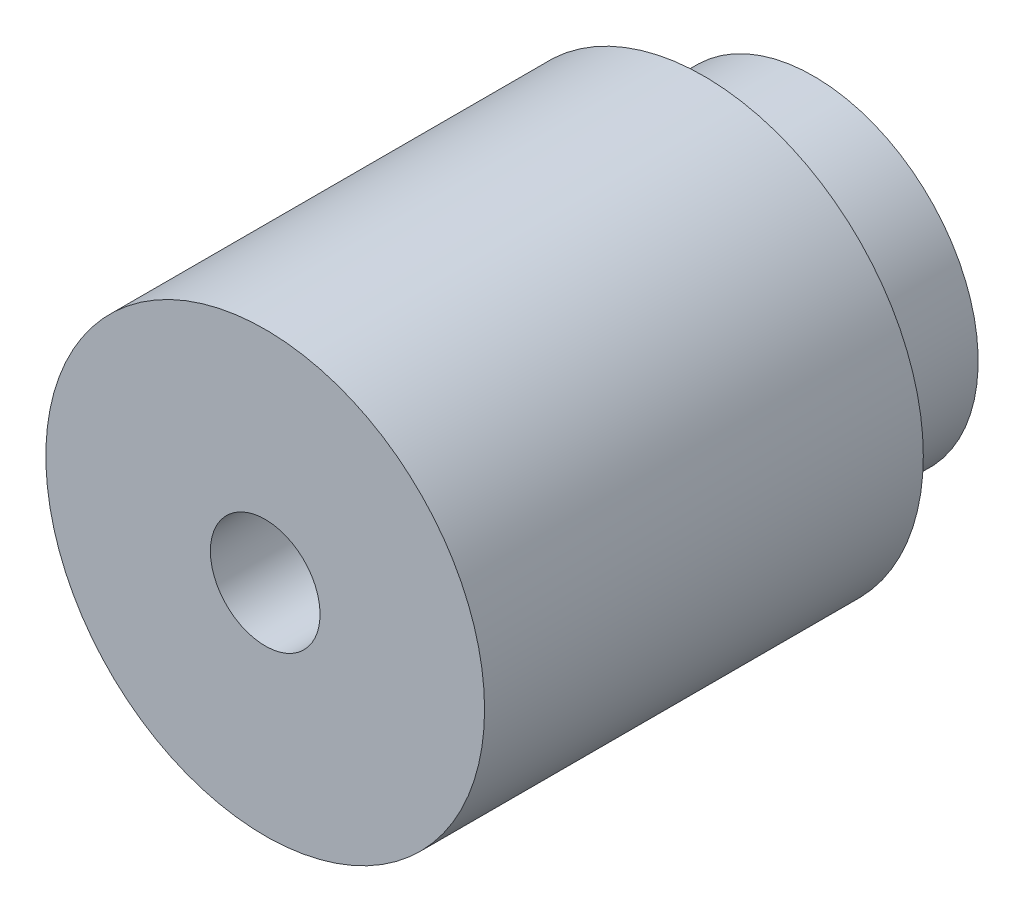
ISO-10303-21;
HEADER;
FILE_DESCRIPTION(('STEP AP214'),'2;1');
FILE_NAME('part.step','',(''),(''),'','','');
FILE_SCHEMA(('AUTOMOTIVE_DESIGN { 1 0 10303 214 1 1 1 1 }'));
ENDSEC;
DATA;
#1=APPLICATION_CONTEXT('core data for automotive mechanical design processes');
#2=APPLICATION_PROTOCOL_DEFINITION('international standard','automotive_design',2000,#1);
#3=PRODUCT_CONTEXT('',#1,'mechanical');
#4=PRODUCT('Part','Part','',(#3));
#5=PRODUCT_RELATED_PRODUCT_CATEGORY('part','',(#4));
#6=PRODUCT_DEFINITION_FORMATION('','',#4);
#7=PRODUCT_DEFINITION_CONTEXT('part definition',#1,'design');
#8=PRODUCT_DEFINITION('design','',#6,#7);
#9=PRODUCT_DEFINITION_SHAPE('','',#8);
#10=(LENGTH_UNIT() NAMED_UNIT(*) SI_UNIT(.MILLI.,.METRE.));
#11=(NAMED_UNIT(*) PLANE_ANGLE_UNIT() SI_UNIT($,.RADIAN.));
#12=(NAMED_UNIT(*) SI_UNIT($,.STERADIAN.) SOLID_ANGLE_UNIT());
#13=UNCERTAINTY_MEASURE_WITH_UNIT(LENGTH_MEASURE(1.E-05),#10,'distance_accuracy_value','');
#14=(GEOMETRIC_REPRESENTATION_CONTEXT(3) GLOBAL_UNCERTAINTY_ASSIGNED_CONTEXT((#13)) GLOBAL_UNIT_ASSIGNED_CONTEXT((#10,
#11,#12)) REPRESENTATION_CONTEXT('',''));
#15=CARTESIAN_POINT('',(0.,0.,0.));
#16=DIRECTION('',(0.,0.,1.));
#17=DIRECTION('',(1.,0.,0.));
#18=AXIS2_PLACEMENT_3D('',#15,#16,#17);
#19=CARTESIAN_POINT('',(0.,0.,-10.));
#20=DIRECTION('',(0.,0.,1.));
#21=DIRECTION('',(1.,0.,0.));
#22=AXIS2_PLACEMENT_3D('',#19,#20,#21);
#23=CYLINDRICAL_SURFACE('',#22,15.);
#24=CARTESIAN_POINT('',(0.,0.,-10.));
#25=DIRECTION('',(0.,0.,-1.));
#26=DIRECTION('',(-1.,0.,0.));
#27=AXIS2_PLACEMENT_3D('',#24,#25,#26);
#28=CIRCLE('',#27,15.);
#29=CARTESIAN_POINT('',(-15.,0.,-10.));
#30=VERTEX_POINT('',#29);
#31=EDGE_CURVE('E11',#30,#30,#28,.T.);
#32=ORIENTED_EDGE('',*,*,#31,.F.);
#33=EDGE_LOOP('',(#32));
#34=FACE_BOUND('',#33,.T.);
#35=CARTESIAN_POINT('',(0.,0.,0.));
#36=DIRECTION('',(0.,0.,-1.));
#37=DIRECTION('',(-1.,0.,0.));
#38=AXIS2_PLACEMENT_3D('',#35,#36,#37);
#39=CIRCLE('',#38,15.);
#40=CARTESIAN_POINT('',(-15.,0.,0.));
#41=VERTEX_POINT('',#40);
#42=EDGE_CURVE('E51',#41,#41,#39,.T.);
#43=ORIENTED_EDGE('',*,*,#42,.T.);
#44=EDGE_LOOP('',(#43));
#45=FACE_BOUND('',#44,.T.);
#46=ADVANCED_FACE('F44',(#34,#45),#23,.T.);
#47=CARTESIAN_POINT('',(0.,0.,-10.));
#48=DIRECTION('',(0.,0.,-1.));
#49=DIRECTION('',(-1.,0.,0.));
#50=AXIS2_PLACEMENT_3D('',#47,#48,#49);
#51=PLANE('',#50);
#52=CARTESIAN_POINT('',(0.,0.,-10.));
#53=DIRECTION('',(0.,0.,-1.));
#54=DIRECTION('',(-1.,0.,0.));
#55=AXIS2_PLACEMENT_3D('',#52,#53,#54);
#56=CIRCLE('',#55,5.);
#57=CARTESIAN_POINT('',(-5.,0.,-10.));
#58=VERTEX_POINT('',#57);
#59=EDGE_CURVE('E57',#58,#58,#56,.T.);
#60=ORIENTED_EDGE('',*,*,#59,.F.);
#61=EDGE_LOOP('',(#60));
#62=FACE_BOUND('',#61,.T.);
#63=ORIENTED_EDGE('',*,*,#31,.T.);
#64=EDGE_LOOP('',(#63));
#65=FACE_BOUND('',#64,.T.);
#66=ADVANCED_FACE('F73',(#62,#65),#51,.T.);
#67=CARTESIAN_POINT('',(0.,0.,0.));
#68=DIRECTION('',(0.,0.,-1.));
#69=DIRECTION('',(-1.,0.,0.));
#70=AXIS2_PLACEMENT_3D('',#67,#68,#69);
#71=PLANE('',#70);
#72=CARTESIAN_POINT('',(0.,0.,0.));
#73=DIRECTION('',(0.,0.,-1.));
#74=DIRECTION('',(-1.,0.,0.));
#75=AXIS2_PLACEMENT_3D('',#72,#73,#74);
#76=CIRCLE('',#75,5.);
#77=CARTESIAN_POINT('',(-5.,0.,0.));
#78=VERTEX_POINT('',#77);
#79=EDGE_CURVE('E47',#78,#78,#76,.T.);
#80=ORIENTED_EDGE('',*,*,#79,.T.);
#81=EDGE_LOOP('',(#80));
#82=FACE_BOUND('',#81,.T.);
#83=ORIENTED_EDGE('',*,*,#42,.F.);
#84=EDGE_LOOP('',(#83));
#85=FACE_BOUND('',#84,.T.);
#86=ADVANCED_FACE('F64',(#82,#85),#71,.F.);
#87=CARTESIAN_POINT('',(0.,0.,40.));
#88=DIRECTION('',(0.,0.,-1.));
#89=DIRECTION('',(-1.,0.,0.));
#90=AXIS2_PLACEMENT_3D('',#87,#88,#89);
#91=CYLINDRICAL_SURFACE('',#90,5.);
#92=ORIENTED_EDGE('',*,*,#59,.T.);
#93=EDGE_LOOP('',(#92));
#94=FACE_BOUND('',#93,.T.);
#95=ORIENTED_EDGE('',*,*,#79,.F.);
#96=EDGE_LOOP('',(#95));
#97=FACE_BOUND('',#96,.T.);
#98=ADVANCED_FACE('F67',(#94,#97),#91,.F.);
#99=CLOSED_SHELL('',(#46,#66,#86,#98));
#100=MANIFOLD_SOLID_BREP('B2',#99);
#101=CARTESIAN_POINT('',(0.,0.,40.));
#102=DIRECTION('',(0.,0.,-1.));
#103=DIRECTION('',(-1.,0.,0.));
#104=AXIS2_PLACEMENT_3D('',#101,#102,#103);
#105=CYLINDRICAL_SURFACE('',#104,20.);
#106=CARTESIAN_POINT('',(0.,0.,40.));
#107=DIRECTION('',(0.,0.,1.));
#108=DIRECTION('',(1.,0.,0.));
#109=AXIS2_PLACEMENT_3D('',#106,#107,#108);
#110=CIRCLE('',#109,20.);
#111=CARTESIAN_POINT('',(20.,0.,40.));
#112=VERTEX_POINT('',#111);
#113=EDGE_CURVE('E43',#112,#112,#110,.T.);
#114=ORIENTED_EDGE('',*,*,#113,.F.);
#115=EDGE_LOOP('',(#114));
#116=FACE_BOUND('',#115,.T.);
#117=CARTESIAN_POINT('',(0.,0.,0.));
#118=DIRECTION('',(0.,0.,1.));
#119=DIRECTION('',(1.,0.,0.));
#120=AXIS2_PLACEMENT_3D('',#117,#118,#119);
#121=CIRCLE('',#120,20.);
#122=CARTESIAN_POINT('',(20.,0.,0.));
#123=VERTEX_POINT('',#122);
#124=EDGE_CURVE('E120',#123,#123,#121,.T.);
#125=ORIENTED_EDGE('',*,*,#124,.T.);
#126=EDGE_LOOP('',(#125));
#127=FACE_BOUND('',#126,.T.);
#128=ADVANCED_FACE('F113',(#116,#127),#105,.T.);
#129=CARTESIAN_POINT('',(0.,0.,40.));
#130=DIRECTION('',(0.,0.,1.));
#131=DIRECTION('',(1.,0.,0.));
#132=AXIS2_PLACEMENT_3D('',#129,#130,#131);
#133=PLANE('',#132);
#134=CARTESIAN_POINT('',(0.,0.,40.));
#135=DIRECTION('',(0.,0.,-1.));
#136=DIRECTION('',(-1.,0.,0.));
#137=AXIS2_PLACEMENT_3D('',#134,#135,#136);
#138=CIRCLE('',#137,5.);
#139=CARTESIAN_POINT('',(-5.,0.,40.));
#140=VERTEX_POINT('',#139);
#141=EDGE_CURVE('E126',#140,#140,#138,.T.);
#142=ORIENTED_EDGE('',*,*,#141,.T.);
#143=EDGE_LOOP('',(#142));
#144=FACE_BOUND('',#143,.T.);
#145=ORIENTED_EDGE('',*,*,#113,.T.);
#146=EDGE_LOOP('',(#145));
#147=FACE_BOUND('',#146,.T.);
#148=ADVANCED_FACE('F143',(#144,#147),#133,.T.);
#149=CARTESIAN_POINT('',(0.,0.,0.));
#150=DIRECTION('',(0.,0.,1.));
#151=DIRECTION('',(1.,0.,0.));
#152=AXIS2_PLACEMENT_3D('',#149,#150,#151);
#153=PLANE('',#152);
#154=CARTESIAN_POINT('',(0.,0.,0.));
#155=DIRECTION('',(0.,0.,1.));
#156=DIRECTION('',(1.,0.,0.));
#157=AXIS2_PLACEMENT_3D('',#154,#155,#156);
#158=CIRCLE('',#157,5.);
#159=CARTESIAN_POINT('',(5.,0.,0.));
#160=VERTEX_POINT('',#159);
#161=EDGE_CURVE('E116',#160,#160,#158,.T.);
#162=ORIENTED_EDGE('',*,*,#161,.T.);
#163=EDGE_LOOP('',(#162));
#164=FACE_BOUND('',#163,.T.);
#165=ORIENTED_EDGE('',*,*,#124,.F.);
#166=EDGE_LOOP('',(#165));
#167=FACE_BOUND('',#166,.T.);
#168=ADVANCED_FACE('F133',(#164,#167),#153,.F.);
#169=CARTESIAN_POINT('',(0.,0.,40.));
#170=DIRECTION('',(0.,0.,-1.));
#171=DIRECTION('',(-1.,0.,0.));
#172=AXIS2_PLACEMENT_3D('',#169,#170,#171);
#173=CYLINDRICAL_SURFACE('',#172,5.);
#174=ORIENTED_EDGE('',*,*,#141,.F.);
#175=EDGE_LOOP('',(#174));
#176=FACE_BOUND('',#175,.T.);
#177=ORIENTED_EDGE('',*,*,#161,.F.);
#178=EDGE_LOOP('',(#177));
#179=FACE_BOUND('',#178,.T.);
#180=ADVANCED_FACE('F136',(#176,#179),#173,.F.);
#181=CLOSED_SHELL('',(#128,#148,#168,#180));
#182=MANIFOLD_SOLID_BREP('B6',#181);
#183=ADVANCED_BREP_SHAPE_REPRESENTATION('',(#18,#100,#182),#14);
#184=SHAPE_DEFINITION_REPRESENTATION(#9,#183);
ENDSEC;
END-ISO-10303-21;
